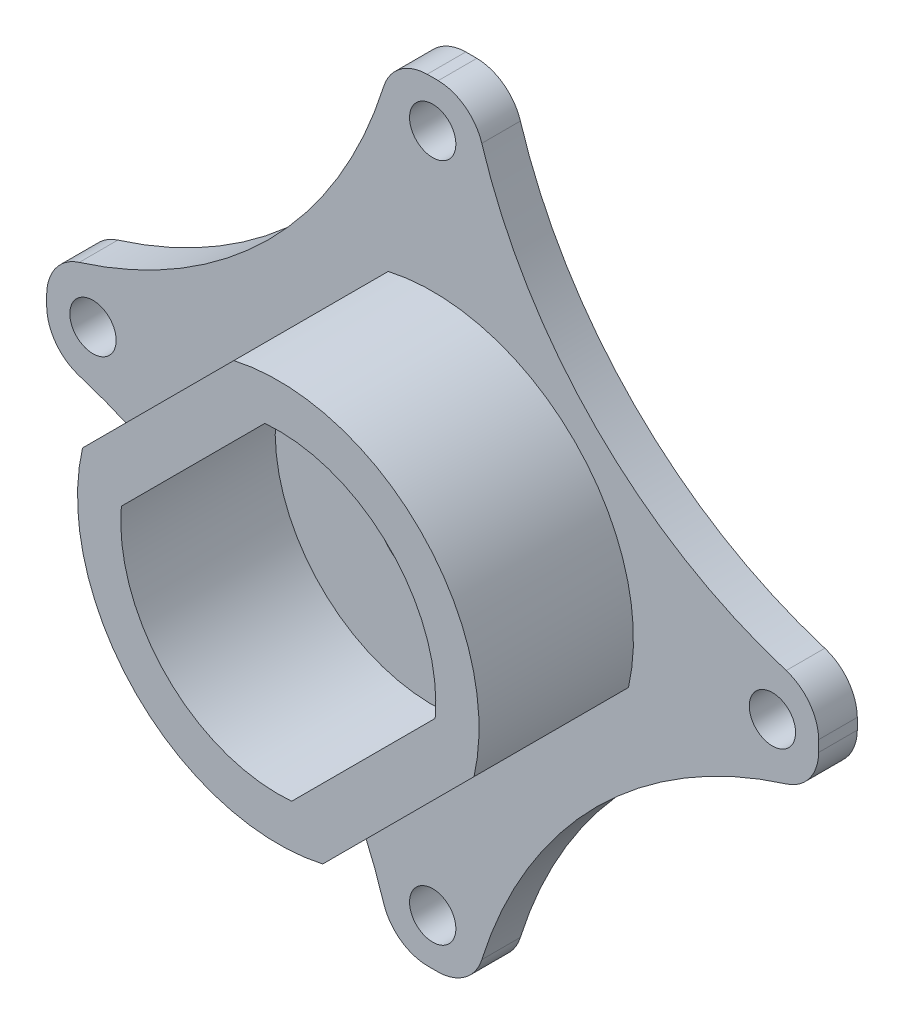
ISO-10303-21;
HEADER;
FILE_DESCRIPTION(('STEP AP214'),'2;1');
FILE_NAME('part.step','',(''),(''),'','','');
FILE_SCHEMA(('AUTOMOTIVE_DESIGN { 1 0 10303 214 1 1 1 1 }'));
ENDSEC;
DATA;
#1=APPLICATION_CONTEXT('core data for automotive mechanical design processes');
#2=APPLICATION_PROTOCOL_DEFINITION('international standard','automotive_design',2000,#1);
#3=PRODUCT_CONTEXT('',#1,'mechanical');
#4=PRODUCT('Part','Part','',(#3));
#5=PRODUCT_RELATED_PRODUCT_CATEGORY('part','',(#4));
#6=PRODUCT_DEFINITION_FORMATION('','',#4);
#7=PRODUCT_DEFINITION_CONTEXT('part definition',#1,'design');
#8=PRODUCT_DEFINITION('design','',#6,#7);
#9=PRODUCT_DEFINITION_SHAPE('','',#8);
#10=(LENGTH_UNIT() NAMED_UNIT(*) SI_UNIT(.MILLI.,.METRE.));
#11=(NAMED_UNIT(*) PLANE_ANGLE_UNIT() SI_UNIT($,.RADIAN.));
#12=(NAMED_UNIT(*) SI_UNIT($,.STERADIAN.) SOLID_ANGLE_UNIT());
#13=UNCERTAINTY_MEASURE_WITH_UNIT(LENGTH_MEASURE(1.E-05),#10,'distance_accuracy_value','');
#14=(GEOMETRIC_REPRESENTATION_CONTEXT(3) GLOBAL_UNCERTAINTY_ASSIGNED_CONTEXT((#13)) GLOBAL_UNIT_ASSIGNED_CONTEXT((#10,
#11,#12)) REPRESENTATION_CONTEXT('',''));
#15=CARTESIAN_POINT('',(0.,0.,0.));
#16=DIRECTION('',(0.,0.,1.));
#17=DIRECTION('',(1.,0.,0.));
#18=AXIS2_PLACEMENT_3D('',#15,#16,#17);
#19=CARTESIAN_POINT('',(0.,0.,2.5));
#20=DIRECTION('',(0.,0.,1.));
#21=DIRECTION('',(1.,0.,0.));
#22=AXIS2_PLACEMENT_3D('',#19,#20,#21);
#23=PLANE('',#22);
#24=CARTESIAN_POINT('',(31.8198051533946,31.8198051533947,2.5));
#25=DIRECTION('',(0.,0.,1.));
#26=DIRECTION('',(1.,0.,0.));
#27=AXIS2_PLACEMENT_3D('',#24,#25,#26);
#28=CIRCLE('',#27,30.);
#29=CARTESIAN_POINT('',(3.17944446720614,22.8906540310857,2.5));
#30=VERTEX_POINT('',#29);
#31=CARTESIAN_POINT('',(22.8906540310857,3.17944446720621,2.5));
#32=VERTEX_POINT('',#31);
#33=EDGE_CURVE('E316',#30,#32,#28,.T.);
#34=ORIENTED_EDGE('',*,*,#33,.F.);
#35=CARTESIAN_POINT('',(0.315408398587288,21.9977389188548,2.5));
#36=DIRECTION('',(0.,0.,1.));
#37=DIRECTION('',(1.,0.,0.));
#38=AXIS2_PLACEMENT_3D('',#35,#36,#37);
#39=CIRCLE('',#38,3.);
#40=CARTESIAN_POINT('',(0.358418634758282,24.9974305896078,2.5));
#41=VERTEX_POINT('',#40);
#42=EDGE_CURVE('E444',#30,#41,#39,.T.);
#43=ORIENTED_EDGE('',*,*,#42,.T.);
#44=CARTESIAN_POINT('',(0.,0.,2.5));
#45=DIRECTION('',(0.,0.,1.));
#46=DIRECTION('',(1.,0.,0.));
#47=AXIS2_PLACEMENT_3D('',#44,#45,#46);
#48=CIRCLE('',#47,25.);
#49=CARTESIAN_POINT('',(-0.358418634758457,24.9974305896078,2.5));
#50=VERTEX_POINT('',#49);
#51=EDGE_CURVE('E376',#41,#50,#48,.T.);
#52=ORIENTED_EDGE('',*,*,#51,.T.);
#53=CARTESIAN_POINT('',(-0.315408398587442,21.9977389188548,2.5));
#54=DIRECTION('',(0.,0.,1.));
#55=DIRECTION('',(1.,0.,0.));
#56=AXIS2_PLACEMENT_3D('',#53,#54,#55);
#57=CIRCLE('',#56,3.);
#58=CARTESIAN_POINT('',(-3.17944446720629,22.8906540310857,2.5));
#59=VERTEX_POINT('',#58);
#60=EDGE_CURVE('E441',#50,#59,#57,.T.);
#61=ORIENTED_EDGE('',*,*,#60,.T.);
#62=CARTESIAN_POINT('',(-31.8198051533948,31.8198051533945,2.5));
#63=DIRECTION('',(0.,0.,1.));
#64=DIRECTION('',(1.,0.,0.));
#65=AXIS2_PLACEMENT_3D('',#62,#63,#64);
#66=CIRCLE('',#65,30.);
#67=CARTESIAN_POINT('',(-22.8906540310857,3.17944446720605,2.5));
#68=VERTEX_POINT('',#67);
#69=EDGE_CURVE('E328',#68,#59,#66,.T.);
#70=ORIENTED_EDGE('',*,*,#69,.F.);
#71=CARTESIAN_POINT('',(-21.9977389188548,0.315408398587206,2.5));
#72=DIRECTION('',(0.,0.,1.));
#73=DIRECTION('',(1.,0.,0.));
#74=AXIS2_PLACEMENT_3D('',#71,#72,#73);
#75=CIRCLE('',#74,3.);
#76=CARTESIAN_POINT('',(-24.9974305896078,0.358418634758189,2.5));
#77=VERTEX_POINT('',#76);
#78=EDGE_CURVE('E438',#68,#77,#75,.T.);
#79=ORIENTED_EDGE('',*,*,#78,.T.);
#80=CARTESIAN_POINT('',(-24.9974305896078,-0.358418634758548,2.5));
#81=VERTEX_POINT('',#80);
#82=EDGE_CURVE('E534',#77,#81,#48,.T.);
#83=ORIENTED_EDGE('',*,*,#82,.T.);
#84=CARTESIAN_POINT('',(-21.9977389188548,-0.315408398587522,2.5));
#85=DIRECTION('',(0.,0.,1.));
#86=DIRECTION('',(1.,0.,0.));
#87=AXIS2_PLACEMENT_3D('',#84,#85,#86);
#88=CIRCLE('',#87,3.);
#89=CARTESIAN_POINT('',(-22.8906540310857,-3.17944446720637,2.5));
#90=VERTEX_POINT('',#89);
#91=EDGE_CURVE('E435',#81,#90,#88,.T.);
#92=ORIENTED_EDGE('',*,*,#91,.T.);
#93=CARTESIAN_POINT('',(-31.8198051533944,-31.8198051533949,2.5));
#94=DIRECTION('',(0.,0.,1.));
#95=DIRECTION('',(1.,0.,0.));
#96=AXIS2_PLACEMENT_3D('',#93,#94,#95);
#97=CIRCLE('',#96,30.);
#98=CARTESIAN_POINT('',(-3.17944446720598,-22.8906540310857,2.5));
#99=VERTEX_POINT('',#98);
#100=EDGE_CURVE('E324',#99,#90,#97,.T.);
#101=ORIENTED_EDGE('',*,*,#100,.F.);
#102=CARTESIAN_POINT('',(-0.315408398587139,-21.9977389188548,2.5));
#103=DIRECTION('',(0.,0.,1.));
#104=DIRECTION('',(1.,0.,0.));
#105=AXIS2_PLACEMENT_3D('',#102,#103,#104);
#106=CIRCLE('',#105,3.);
#107=CARTESIAN_POINT('',(-0.358418634758112,-24.9974305896078,2.5));
#108=VERTEX_POINT('',#107);
#109=EDGE_CURVE('E432',#99,#108,#106,.T.);
#110=ORIENTED_EDGE('',*,*,#109,.T.);
#111=CARTESIAN_POINT('',(0.358418634758633,-24.9974305896078,2.5));
#112=VERTEX_POINT('',#111);
#113=EDGE_CURVE('E374',#108,#112,#48,.T.);
#114=ORIENTED_EDGE('',*,*,#113,.T.);
#115=CARTESIAN_POINT('',(0.315408398587597,-21.9977389188548,2.5));
#116=DIRECTION('',(0.,0.,1.));
#117=DIRECTION('',(1.,0.,0.));
#118=AXIS2_PLACEMENT_3D('',#115,#116,#117);
#119=CIRCLE('',#118,3.);
#120=CARTESIAN_POINT('',(3.17944446720645,-22.8906540310857,2.5));
#121=VERTEX_POINT('',#120);
#122=EDGE_CURVE('E429',#112,#121,#119,.T.);
#123=ORIENTED_EDGE('',*,*,#122,.T.);
#124=CARTESIAN_POINT('',(31.819805153395,-31.8198051533942,2.5));
#125=DIRECTION('',(0.,0.,1.));
#126=DIRECTION('',(1.,0.,0.));
#127=AXIS2_PLACEMENT_3D('',#124,#125,#126);
#128=CIRCLE('',#127,30.);
#129=CARTESIAN_POINT('',(22.8906540310858,-3.17944446720589,2.5));
#130=VERTEX_POINT('',#129);
#131=EDGE_CURVE('E320',#130,#121,#128,.T.);
#132=ORIENTED_EDGE('',*,*,#131,.F.);
#133=CARTESIAN_POINT('',(21.9977389188548,-0.315408398587054,2.5));
#134=DIRECTION('',(0.,0.,1.));
#135=DIRECTION('',(1.,0.,0.));
#136=AXIS2_PLACEMENT_3D('',#133,#134,#135);
#137=CIRCLE('',#136,3.);
#138=CARTESIAN_POINT('',(24.9974305896078,-0.358418634758015,2.5));
#139=VERTEX_POINT('',#138);
#140=EDGE_CURVE('E426',#130,#139,#137,.T.);
#141=ORIENTED_EDGE('',*,*,#140,.T.);
#142=CARTESIAN_POINT('',(24.9974305896078,0.358418634758364,2.5));
#143=VERTEX_POINT('',#142);
#144=EDGE_CURVE('E370',#139,#143,#48,.T.);
#145=ORIENTED_EDGE('',*,*,#144,.T.);
#146=CARTESIAN_POINT('',(21.9977389188548,0.315408398587361,2.5));
#147=DIRECTION('',(0.,0.,1.));
#148=DIRECTION('',(1.,0.,0.));
#149=AXIS2_PLACEMENT_3D('',#146,#147,#148);
#150=CIRCLE('',#149,3.);
#151=EDGE_CURVE('E423',#143,#32,#150,.T.);
#152=ORIENTED_EDGE('',*,*,#151,.T.);
#153=EDGE_LOOP('',(#34,#43,#52,#61,#70,#79,#83,#92,#101,#110,#114,#123,#132,#141,#145,#152));
#154=FACE_BOUND('',#153,.T.);
#155=CARTESIAN_POINT('',(22.,-2.26077837006677E-12,2.5));
#156=DIRECTION('',(0.,0.,1.));
#157=DIRECTION('',(1.,0.,0.));
#158=AXIS2_PLACEMENT_3D('',#155,#156,#157);
#159=CIRCLE('',#158,1.5);
#160=CARTESIAN_POINT('',(23.5,-2.26077837006677E-12,2.5));
#161=VERTEX_POINT('',#160);
#162=EDGE_CURVE('E346',#161,#161,#159,.T.);
#163=ORIENTED_EDGE('',*,*,#162,.F.);
#164=EDGE_LOOP('',(#163));
#165=FACE_BOUND('',#164,.T.);
#166=CARTESIAN_POINT('',(0.,22.,2.5));
#167=DIRECTION('',(0.,0.,1.));
#168=DIRECTION('',(1.,0.,0.));
#169=AXIS2_PLACEMENT_3D('',#166,#167,#168);
#170=CIRCLE('',#169,1.5);
#171=CARTESIAN_POINT('',(1.5,22.,2.5));
#172=VERTEX_POINT('',#171);
#173=EDGE_CURVE('E362',#172,#172,#170,.T.);
#174=ORIENTED_EDGE('',*,*,#173,.F.);
#175=EDGE_LOOP('',(#174));
#176=FACE_BOUND('',#175,.T.);
#177=CARTESIAN_POINT('',(-22.,-2.25991100832879E-12,2.5));
#178=DIRECTION('',(0.,0.,1.));
#179=DIRECTION('',(-1.,0.,0.));
#180=AXIS2_PLACEMENT_3D('',#177,#178,#179);
#181=CIRCLE('',#180,1.5);
#182=CARTESIAN_POINT('',(-23.5,-2.25991100832879E-12,2.5));
#183=VERTEX_POINT('',#182);
#184=EDGE_CURVE('E354',#183,#183,#181,.T.);
#185=ORIENTED_EDGE('',*,*,#184,.F.);
#186=EDGE_LOOP('',(#185));
#187=FACE_BOUND('',#186,.T.);
#188=CARTESIAN_POINT('',(-4.52068937839556E-12,-22.,2.5));
#189=DIRECTION('',(0.,0.,1.));
#190=DIRECTION('',(1.,0.,0.));
#191=AXIS2_PLACEMENT_3D('',#188,#189,#190);
#192=CIRCLE('',#191,1.5);
#193=CARTESIAN_POINT('',(1.49999999999548,-22.,2.5));
#194=VERTEX_POINT('',#193);
#195=EDGE_CURVE('E337',#194,#194,#192,.T.);
#196=ORIENTED_EDGE('',*,*,#195,.F.);
#197=EDGE_LOOP('',(#196));
#198=FACE_BOUND('',#197,.T.);
#199=DIRECTION('',(0.707106781186543,0.707106781186552,0.));
#200=VECTOR('',#199,1.);
#201=CARTESIAN_POINT('',(2.87919510748573,-12.6771540786184,2.5));
#202=LINE('',#201,#200);
#203=CARTESIAN_POINT('',(2.87919510748573,-12.6771540786184,2.5));
#204=VERTEX_POINT('',#203);
#205=CARTESIAN_POINT('',(12.6771540786184,-2.87919510748559,2.5));
#206=VERTEX_POINT('',#205);
#207=EDGE_CURVE('E280',#204,#206,#202,.T.);
#208=ORIENTED_EDGE('',*,*,#207,.F.);
#209=CARTESIAN_POINT('',(0.,0.,2.5));
#210=DIRECTION('',(0.,0.,1.));
#211=DIRECTION('',(1.,0.,0.));
#212=AXIS2_PLACEMENT_3D('',#209,#210,#211);
#213=CIRCLE('',#212,13.);
#214=CARTESIAN_POINT('',(-12.6771540786184,2.87919510748559,2.5));
#215=VERTEX_POINT('',#214);
#216=EDGE_CURVE('E230',#215,#204,#213,.T.);
#217=ORIENTED_EDGE('',*,*,#216,.F.);
#218=DIRECTION('',(-0.707106781186543,-0.707106781186551,0.));
#219=VECTOR('',#218,1.);
#220=CARTESIAN_POINT('',(-12.6771540786184,2.87919510748559,2.5));
#221=LINE('',#220,#219);
#222=CARTESIAN_POINT('',(-2.87919510748573,12.6771540786184,2.5));
#223=VERTEX_POINT('',#222);
#224=EDGE_CURVE('E267',#223,#215,#221,.T.);
#225=ORIENTED_EDGE('',*,*,#224,.F.);
#226=CARTESIAN_POINT('',(0.,0.,2.5));
#227=DIRECTION('',(0.,0.,1.));
#228=DIRECTION('',(1.,0.,0.));
#229=AXIS2_PLACEMENT_3D('',#226,#227,#228);
#230=CIRCLE('',#229,13.);
#231=EDGE_CURVE('E283',#206,#223,#230,.T.);
#232=ORIENTED_EDGE('',*,*,#231,.F.);
#233=EDGE_LOOP('',(#208,#217,#225,#232));
#234=FACE_BOUND('',#233,.T.);
#235=ADVANCED_FACE('F47',(#154,#165,#176,#187,#198,#234),#23,.T.);
#236=CARTESIAN_POINT('',(0.,0.,2.5));
#237=DIRECTION('',(0.,0.,-1.));
#238=DIRECTION('',(-1.,0.,0.));
#239=AXIS2_PLACEMENT_3D('',#236,#237,#238);
#240=CYLINDRICAL_SURFACE('',#239,25.);
#241=ORIENTED_EDGE('',*,*,#51,.F.);
#242=DIRECTION('',(0.,0.,-1.));
#243=VECTOR('',#242,1.);
#244=CARTESIAN_POINT('',(0.358418634758282,24.9974305896078,2.5));
#245=LINE('',#244,#243);
#246=CARTESIAN_POINT('',(0.358418634758282,24.9974305896078,0.));
#247=VERTEX_POINT('',#246);
#248=EDGE_CURVE('E389',#41,#247,#245,.T.);
#249=ORIENTED_EDGE('',*,*,#248,.T.);
#250=CARTESIAN_POINT('',(0.,0.,0.));
#251=DIRECTION('',(0.,0.,1.));
#252=DIRECTION('',(1.,0.,0.));
#253=AXIS2_PLACEMENT_3D('',#250,#251,#252);
#254=CIRCLE('',#253,25.);
#255=CARTESIAN_POINT('',(-0.358418634758457,24.9974305896078,0.));
#256=VERTEX_POINT('',#255);
#257=EDGE_CURVE('E375',#247,#256,#254,.T.);
#258=ORIENTED_EDGE('',*,*,#257,.T.);
#259=DIRECTION('',(0.,0.,-1.));
#260=VECTOR('',#259,1.);
#261=CARTESIAN_POINT('',(-0.358418634758457,24.9974305896078,2.5));
#262=LINE('',#261,#260);
#263=EDGE_CURVE('E385',#256,#50,#262,.F.);
#264=ORIENTED_EDGE('',*,*,#263,.T.);
#265=EDGE_LOOP('',(#241,#249,#258,#264));
#266=FACE_BOUND('',#265,.T.);
#267=ADVANCED_FACE('F516',(#266),#240,.T.);
#268=ORIENTED_EDGE('',*,*,#82,.F.);
#269=DIRECTION('',(0.,0.,-1.));
#270=VECTOR('',#269,1.);
#271=CARTESIAN_POINT('',(-24.9974305896078,0.358418634758189,2.5));
#272=LINE('',#271,#270);
#273=CARTESIAN_POINT('',(-24.9974305896078,0.358418634758189,0.));
#274=VERTEX_POINT('',#273);
#275=EDGE_CURVE('E457',#77,#274,#272,.T.);
#276=ORIENTED_EDGE('',*,*,#275,.T.);
#277=CARTESIAN_POINT('',(-24.9974305896078,-0.358418634758548,0.));
#278=VERTEX_POINT('',#277);
#279=EDGE_CURVE('E381',#274,#278,#254,.T.);
#280=ORIENTED_EDGE('',*,*,#279,.T.);
#281=DIRECTION('',(0.,0.,-1.));
#282=VECTOR('',#281,1.);
#283=CARTESIAN_POINT('',(-24.9974305896078,-0.358418634758548,2.5));
#284=LINE('',#283,#282);
#285=EDGE_CURVE('E453',#278,#81,#284,.F.);
#286=ORIENTED_EDGE('',*,*,#285,.T.);
#287=EDGE_LOOP('',(#268,#276,#280,#286));
#288=FACE_BOUND('',#287,.T.);
#289=ADVANCED_FACE('F535',(#288),#240,.T.);
#290=ORIENTED_EDGE('',*,*,#113,.F.);
#291=DIRECTION('',(0.,0.,-1.));
#292=VECTOR('',#291,1.);
#293=CARTESIAN_POINT('',(-0.358418634758112,-24.9974305896078,2.5));
#294=LINE('',#293,#292);
#295=CARTESIAN_POINT('',(-0.358418634758112,-24.9974305896078,0.));
#296=VERTEX_POINT('',#295);
#297=EDGE_CURVE('E471',#108,#296,#294,.T.);
#298=ORIENTED_EDGE('',*,*,#297,.T.);
#299=CARTESIAN_POINT('',(0.358418634758633,-24.9974305896078,0.));
#300=VERTEX_POINT('',#299);
#301=EDGE_CURVE('E377',#296,#300,#254,.T.);
#302=ORIENTED_EDGE('',*,*,#301,.T.);
#303=DIRECTION('',(0.,0.,-1.));
#304=VECTOR('',#303,1.);
#305=CARTESIAN_POINT('',(0.358418634758633,-24.9974305896078,2.5));
#306=LINE('',#305,#304);
#307=EDGE_CURVE('E467',#300,#112,#306,.F.);
#308=ORIENTED_EDGE('',*,*,#307,.T.);
#309=EDGE_LOOP('',(#290,#298,#302,#308));
#310=FACE_BOUND('',#309,.T.);
#311=ADVANCED_FACE('F545',(#310),#240,.T.);
#312=CARTESIAN_POINT('',(0.,0.,2.5));
#313=DIRECTION('',(0.,0.,1.));
#314=DIRECTION('',(1.,0.,0.));
#315=AXIS2_PLACEMENT_3D('',#312,#313,#314);
#316=CIRCLE('',#315,10.2);
#317=CARTESIAN_POINT('',(-10.163012908704,0.867852877806112,2.5));
#318=VERTEX_POINT('',#317);
#319=CARTESIAN_POINT('',(0.867852877806223,-10.163012908704,2.5));
#320=VERTEX_POINT('',#319);
#321=EDGE_CURVE('E71',#318,#320,#316,.T.);
#322=ORIENTED_EDGE('',*,*,#321,.T.);
#323=DIRECTION('',(0.707106781186544,0.707106781186551,0.));
#324=VECTOR('',#323,1.);
#325=CARTESIAN_POINT('',(0.867852877806221,-10.163012908704,2.5));
#326=LINE('',#325,#324);
#327=CARTESIAN_POINT('',(10.163012908704,-0.867852877806111,2.5));
#328=VERTEX_POINT('',#327);
#329=EDGE_CURVE('E228',#320,#328,#326,.T.);
#330=ORIENTED_EDGE('',*,*,#329,.T.);
#331=CARTESIAN_POINT('',(0.,0.,2.5));
#332=DIRECTION('',(0.,0.,1.));
#333=DIRECTION('',(1.,0.,0.));
#334=AXIS2_PLACEMENT_3D('',#331,#332,#333);
#335=CIRCLE('',#334,10.2);
#336=CARTESIAN_POINT('',(-0.867852877806226,10.163012908704,2.5));
#337=VERTEX_POINT('',#336);
#338=EDGE_CURVE('E249',#328,#337,#335,.T.);
#339=ORIENTED_EDGE('',*,*,#338,.T.);
#340=DIRECTION('',(-0.707106781186544,-0.707106781186551,0.));
#341=VECTOR('',#340,1.);
#342=CARTESIAN_POINT('',(-10.163012908704,0.867852877806111,2.5));
#343=LINE('',#342,#341);
#344=EDGE_CURVE('E222',#337,#318,#343,.T.);
#345=ORIENTED_EDGE('',*,*,#344,.T.);
#346=EDGE_LOOP('',(#322,#330,#339,#345));
#347=FACE_BOUND('',#346,.T.);
#348=CARTESIAN_POINT('',(0.,0.,2.5));
#349=DIRECTION('',(0.,0.,-1.));
#350=DIRECTION('',(-1.,0.,0.));
#351=AXIS2_PLACEMENT_3D('',#348,#349,#350);
#352=CIRCLE('',#351,4.);
#353=CARTESIAN_POINT('',(-4.,0.,2.5));
#354=VERTEX_POINT('',#353);
#355=EDGE_CURVE('E332',#354,#354,#352,.T.);
#356=ORIENTED_EDGE('',*,*,#355,.T.);
#357=EDGE_LOOP('',(#356));
#358=FACE_BOUND('',#357,.T.);
#359=ADVANCED_FACE('F569',(#347,#358),#23,.T.);
#360=CARTESIAN_POINT('',(0.,0.,0.));
#361=DIRECTION('',(0.,0.,1.));
#362=DIRECTION('',(1.,0.,0.));
#363=AXIS2_PLACEMENT_3D('',#360,#361,#362);
#364=PLANE('',#363);
#365=CARTESIAN_POINT('',(0.,0.,0.));
#366=DIRECTION('',(0.,0.,1.));
#367=DIRECTION('',(1.,0.,0.));
#368=AXIS2_PLACEMENT_3D('',#365,#366,#367);
#369=CIRCLE('',#368,4.);
#370=CARTESIAN_POINT('',(4.,0.,0.));
#371=VERTEX_POINT('',#370);
#372=EDGE_CURVE('E336',#371,#371,#369,.T.);
#373=ORIENTED_EDGE('',*,*,#372,.T.);
#374=EDGE_LOOP('',(#373));
#375=FACE_BOUND('',#374,.T.);
#376=ORIENTED_EDGE('',*,*,#257,.F.);
#377=CARTESIAN_POINT('',(0.315408398587288,21.9977389188548,0.));
#378=DIRECTION('',(0.,0.,1.));
#379=DIRECTION('',(1.,0.,0.));
#380=AXIS2_PLACEMENT_3D('',#377,#378,#379);
#381=CIRCLE('',#380,3.);
#382=CARTESIAN_POINT('',(3.17944446720614,22.8906540310857,0.));
#383=VERTEX_POINT('',#382);
#384=EDGE_CURVE('E414',#247,#383,#381,.F.);
#385=ORIENTED_EDGE('',*,*,#384,.T.);
#386=CARTESIAN_POINT('',(31.8198051533946,31.8198051533947,0.));
#387=DIRECTION('',(0.,0.,-1.));
#388=DIRECTION('',(-1.,0.,0.));
#389=AXIS2_PLACEMENT_3D('',#386,#387,#388);
#390=CIRCLE('',#389,30.);
#391=CARTESIAN_POINT('',(22.8906540310857,3.17944446720621,0.));
#392=VERTEX_POINT('',#391);
#393=EDGE_CURVE('E305',#392,#383,#390,.T.);
#394=ORIENTED_EDGE('',*,*,#393,.F.);
#395=CARTESIAN_POINT('',(21.9977389188548,0.315408398587361,0.));
#396=DIRECTION('',(0.,0.,1.));
#397=DIRECTION('',(1.,0.,0.));
#398=AXIS2_PLACEMENT_3D('',#395,#396,#397);
#399=CIRCLE('',#398,3.);
#400=CARTESIAN_POINT('',(24.9974305896078,0.358418634758364,0.));
#401=VERTEX_POINT('',#400);
#402=EDGE_CURVE('E393',#392,#401,#399,.F.);
#403=ORIENTED_EDGE('',*,*,#402,.T.);
#404=CARTESIAN_POINT('',(24.9974305896078,-0.358418634758015,0.));
#405=VERTEX_POINT('',#404);
#406=EDGE_CURVE('E366',#405,#401,#254,.T.);
#407=ORIENTED_EDGE('',*,*,#406,.F.);
#408=CARTESIAN_POINT('',(21.9977389188548,-0.315408398587054,0.));
#409=DIRECTION('',(0.,0.,1.));
#410=DIRECTION('',(1.,0.,0.));
#411=AXIS2_PLACEMENT_3D('',#408,#409,#410);
#412=CIRCLE('',#411,3.);
#413=CARTESIAN_POINT('',(22.8906540310858,-3.17944446720589,0.));
#414=VERTEX_POINT('',#413);
#415=EDGE_CURVE('E396',#405,#414,#412,.F.);
#416=ORIENTED_EDGE('',*,*,#415,.T.);
#417=CARTESIAN_POINT('',(31.819805153395,-31.8198051533942,0.));
#418=DIRECTION('',(0.,0.,-1.));
#419=DIRECTION('',(-1.,0.,0.));
#420=AXIS2_PLACEMENT_3D('',#417,#418,#419);
#421=CIRCLE('',#420,30.);
#422=CARTESIAN_POINT('',(3.17944446720645,-22.8906540310857,0.));
#423=VERTEX_POINT('',#422);
#424=EDGE_CURVE('E301',#423,#414,#421,.T.);
#425=ORIENTED_EDGE('',*,*,#424,.F.);
#426=CARTESIAN_POINT('',(0.315408398587597,-21.9977389188548,0.));
#427=DIRECTION('',(0.,0.,1.));
#428=DIRECTION('',(1.,0.,0.));
#429=AXIS2_PLACEMENT_3D('',#426,#427,#428);
#430=CIRCLE('',#429,3.);
#431=EDGE_CURVE('E399',#423,#300,#430,.F.);
#432=ORIENTED_EDGE('',*,*,#431,.T.);
#433=ORIENTED_EDGE('',*,*,#301,.F.);
#434=CARTESIAN_POINT('',(-0.315408398587139,-21.9977389188548,0.));
#435=DIRECTION('',(0.,0.,1.));
#436=DIRECTION('',(1.,0.,0.));
#437=AXIS2_PLACEMENT_3D('',#434,#435,#436);
#438=CIRCLE('',#437,3.);
#439=CARTESIAN_POINT('',(-3.17944446720598,-22.8906540310857,0.));
#440=VERTEX_POINT('',#439);
#441=EDGE_CURVE('E402',#296,#440,#438,.F.);
#442=ORIENTED_EDGE('',*,*,#441,.T.);
#443=CARTESIAN_POINT('',(-31.8198051533944,-31.8198051533949,0.));
#444=DIRECTION('',(0.,0.,-1.));
#445=DIRECTION('',(-1.,0.,0.));
#446=AXIS2_PLACEMENT_3D('',#443,#444,#445);
#447=CIRCLE('',#446,30.);
#448=CARTESIAN_POINT('',(-22.8906540310857,-3.17944446720637,0.));
#449=VERTEX_POINT('',#448);
#450=EDGE_CURVE('E306',#449,#440,#447,.T.);
#451=ORIENTED_EDGE('',*,*,#450,.F.);
#452=CARTESIAN_POINT('',(-21.9977389188548,-0.315408398587522,0.));
#453=DIRECTION('',(0.,0.,1.));
#454=DIRECTION('',(1.,0.,0.));
#455=AXIS2_PLACEMENT_3D('',#452,#453,#454);
#456=CIRCLE('',#455,3.);
#457=EDGE_CURVE('E405',#449,#278,#456,.F.);
#458=ORIENTED_EDGE('',*,*,#457,.T.);
#459=ORIENTED_EDGE('',*,*,#279,.F.);
#460=CARTESIAN_POINT('',(-21.9977389188548,0.315408398587206,0.));
#461=DIRECTION('',(0.,0.,1.));
#462=DIRECTION('',(1.,0.,0.));
#463=AXIS2_PLACEMENT_3D('',#460,#461,#462);
#464=CIRCLE('',#463,3.);
#465=CARTESIAN_POINT('',(-22.8906540310857,3.17944446720605,0.));
#466=VERTEX_POINT('',#465);
#467=EDGE_CURVE('E408',#274,#466,#464,.F.);
#468=ORIENTED_EDGE('',*,*,#467,.T.);
#469=CARTESIAN_POINT('',(-31.8198051533948,31.8198051533945,0.));
#470=DIRECTION('',(0.,0.,-1.));
#471=DIRECTION('',(-1.,0.,0.));
#472=AXIS2_PLACEMENT_3D('',#469,#470,#471);
#473=CIRCLE('',#472,30.);
#474=CARTESIAN_POINT('',(-3.17944446720629,22.8906540310857,0.));
#475=VERTEX_POINT('',#474);
#476=EDGE_CURVE('E300',#475,#466,#473,.T.);
#477=ORIENTED_EDGE('',*,*,#476,.F.);
#478=CARTESIAN_POINT('',(-0.315408398587442,21.9977389188548,0.));
#479=DIRECTION('',(0.,0.,1.));
#480=DIRECTION('',(1.,0.,0.));
#481=AXIS2_PLACEMENT_3D('',#478,#479,#480);
#482=CIRCLE('',#481,3.);
#483=EDGE_CURVE('E411',#475,#256,#482,.F.);
#484=ORIENTED_EDGE('',*,*,#483,.T.);
#485=EDGE_LOOP('',(#376,#385,#394,#403,#407,#416,#425,#432,#433,#442,#451,#458,#459,#468,#477,#484));
#486=FACE_BOUND('',#485,.T.);
#487=CARTESIAN_POINT('',(0.,22.,0.));
#488=DIRECTION('',(0.,0.,1.));
#489=DIRECTION('',(1.,0.,0.));
#490=AXIS2_PLACEMENT_3D('',#487,#488,#489);
#491=CIRCLE('',#490,1.5);
#492=CARTESIAN_POINT('',(1.5,22.,0.));
#493=VERTEX_POINT('',#492);
#494=EDGE_CURVE('E358',#493,#493,#491,.T.);
#495=ORIENTED_EDGE('',*,*,#494,.T.);
#496=EDGE_LOOP('',(#495));
#497=FACE_BOUND('',#496,.T.);
#498=CARTESIAN_POINT('',(-22.,-2.25991100832879E-12,0.));
#499=DIRECTION('',(0.,0.,1.));
#500=DIRECTION('',(-1.,0.,0.));
#501=AXIS2_PLACEMENT_3D('',#498,#499,#500);
#502=CIRCLE('',#501,1.5);
#503=CARTESIAN_POINT('',(-23.5,-2.25991100832879E-12,0.));
#504=VERTEX_POINT('',#503);
#505=EDGE_CURVE('E350',#504,#504,#502,.T.);
#506=ORIENTED_EDGE('',*,*,#505,.T.);
#507=EDGE_LOOP('',(#506));
#508=FACE_BOUND('',#507,.T.);
#509=CARTESIAN_POINT('',(22.,-2.26077837006677E-12,0.));
#510=DIRECTION('',(0.,0.,1.));
#511=DIRECTION('',(1.,0.,0.));
#512=AXIS2_PLACEMENT_3D('',#509,#510,#511);
#513=CIRCLE('',#512,1.5);
#514=CARTESIAN_POINT('',(23.5,-2.26077837006677E-12,0.));
#515=VERTEX_POINT('',#514);
#516=EDGE_CURVE('E341',#515,#515,#513,.T.);
#517=ORIENTED_EDGE('',*,*,#516,.T.);
#518=EDGE_LOOP('',(#517));
#519=FACE_BOUND('',#518,.T.);
#520=CARTESIAN_POINT('',(-4.52068937839556E-12,-22.,0.));
#521=DIRECTION('',(0.,0.,1.));
#522=DIRECTION('',(1.,0.,0.));
#523=AXIS2_PLACEMENT_3D('',#520,#521,#522);
#524=CIRCLE('',#523,1.5);
#525=CARTESIAN_POINT('',(1.49999999999548,-22.,0.));
#526=VERTEX_POINT('',#525);
#527=EDGE_CURVE('E342',#526,#526,#524,.T.);
#528=ORIENTED_EDGE('',*,*,#527,.T.);
#529=EDGE_LOOP('',(#528));
#530=FACE_BOUND('',#529,.T.);
#531=ADVANCED_FACE('F501',(#375,#486,#497,#508,#519,#530),#364,.F.);
#532=ORIENTED_EDGE('',*,*,#144,.F.);
#533=DIRECTION('',(0.,0.,-1.));
#534=VECTOR('',#533,1.);
#535=CARTESIAN_POINT('',(24.9974305896078,-0.358418634758015,2.5));
#536=LINE('',#535,#534);
#537=EDGE_CURVE('E11',#139,#405,#536,.T.);
#538=ORIENTED_EDGE('',*,*,#537,.T.);
#539=ORIENTED_EDGE('',*,*,#406,.T.);
#540=DIRECTION('',(0.,0.,-1.));
#541=VECTOR('',#540,1.);
#542=CARTESIAN_POINT('',(24.9974305896078,0.358418634758364,2.5));
#543=LINE('',#542,#541);
#544=EDGE_CURVE('E56',#401,#143,#543,.F.);
#545=ORIENTED_EDGE('',*,*,#544,.T.);
#546=EDGE_LOOP('',(#532,#538,#539,#545));
#547=FACE_BOUND('',#546,.T.);
#548=ADVANCED_FACE('F486',(#547),#240,.T.);
#549=CARTESIAN_POINT('',(0.,22.,2.5));
#550=DIRECTION('',(0.,0.,-1.));
#551=DIRECTION('',(-1.,0.,0.));
#552=AXIS2_PLACEMENT_3D('',#549,#550,#551);
#553=CYLINDRICAL_SURFACE('',#552,1.5);
#554=ORIENTED_EDGE('',*,*,#173,.T.);
#555=EDGE_LOOP('',(#554));
#556=FACE_BOUND('',#555,.T.);
#557=ORIENTED_EDGE('',*,*,#494,.F.);
#558=EDGE_LOOP('',(#557));
#559=FACE_BOUND('',#558,.T.);
#560=ADVANCED_FACE('F611',(#556,#559),#553,.F.);
#561=CARTESIAN_POINT('',(-22.,-2.25991100832879E-12,2.5));
#562=DIRECTION('',(0.,0.,-1.));
#563=DIRECTION('',(-1.,0.,0.));
#564=AXIS2_PLACEMENT_3D('',#561,#562,#563);
#565=CYLINDRICAL_SURFACE('',#564,1.5);
#566=ORIENTED_EDGE('',*,*,#184,.T.);
#567=EDGE_LOOP('',(#566));
#568=FACE_BOUND('',#567,.T.);
#569=ORIENTED_EDGE('',*,*,#505,.F.);
#570=EDGE_LOOP('',(#569));
#571=FACE_BOUND('',#570,.T.);
#572=ADVANCED_FACE('F608',(#568,#571),#565,.F.);
#573=CARTESIAN_POINT('',(22.,-2.26077837006677E-12,2.5));
#574=DIRECTION('',(0.,0.,-1.));
#575=DIRECTION('',(-1.,0.,0.));
#576=AXIS2_PLACEMENT_3D('',#573,#574,#575);
#577=CYLINDRICAL_SURFACE('',#576,1.5);
#578=ORIENTED_EDGE('',*,*,#162,.T.);
#579=EDGE_LOOP('',(#578));
#580=FACE_BOUND('',#579,.T.);
#581=ORIENTED_EDGE('',*,*,#516,.F.);
#582=EDGE_LOOP('',(#581));
#583=FACE_BOUND('',#582,.T.);
#584=ADVANCED_FACE('F601',(#580,#583),#577,.F.);
#585=CARTESIAN_POINT('',(-4.52068937839556E-12,-22.,2.5));
#586=DIRECTION('',(0.,0.,-1.));
#587=DIRECTION('',(-1.,0.,0.));
#588=AXIS2_PLACEMENT_3D('',#585,#586,#587);
#589=CYLINDRICAL_SURFACE('',#588,1.5);
#590=ORIENTED_EDGE('',*,*,#195,.T.);
#591=EDGE_LOOP('',(#590));
#592=FACE_BOUND('',#591,.T.);
#593=ORIENTED_EDGE('',*,*,#527,.F.);
#594=EDGE_LOOP('',(#593));
#595=FACE_BOUND('',#594,.T.);
#596=ADVANCED_FACE('F591',(#592,#595),#589,.F.);
#597=CARTESIAN_POINT('',(0.,0.,2.5));
#598=DIRECTION('',(0.,0.,-1.));
#599=DIRECTION('',(-1.,0.,0.));
#600=AXIS2_PLACEMENT_3D('',#597,#598,#599);
#601=CYLINDRICAL_SURFACE('',#600,4.);
#602=ORIENTED_EDGE('',*,*,#355,.F.);
#603=EDGE_LOOP('',(#602));
#604=FACE_BOUND('',#603,.T.);
#605=ORIENTED_EDGE('',*,*,#372,.F.);
#606=EDGE_LOOP('',(#605));
#607=FACE_BOUND('',#606,.T.);
#608=ADVANCED_FACE('F587',(#604,#607),#601,.F.);
#609=CARTESIAN_POINT('',(31.8198051533946,31.8198051533947,10.));
#610=DIRECTION('',(0.,0.,-1.));
#611=DIRECTION('',(-1.,0.,0.));
#612=AXIS2_PLACEMENT_3D('',#609,#610,#611);
#613=CYLINDRICAL_SURFACE('',#612,30.);
#614=ORIENTED_EDGE('',*,*,#393,.T.);
#615=DIRECTION('',(0.,0.,-1.));
#616=VECTOR('',#615,1.);
#617=CARTESIAN_POINT('',(3.17944446720613,22.8906540310857,10.));
#618=LINE('',#617,#616);
#619=EDGE_CURVE('E420',#383,#30,#618,.F.);
#620=ORIENTED_EDGE('',*,*,#619,.T.);
#621=ORIENTED_EDGE('',*,*,#33,.T.);
#622=DIRECTION('',(0.,0.,-1.));
#623=VECTOR('',#622,1.);
#624=CARTESIAN_POINT('',(22.8906540310857,3.17944446720621,10.));
#625=LINE('',#624,#623);
#626=EDGE_CURVE('E417',#32,#392,#625,.T.);
#627=ORIENTED_EDGE('',*,*,#626,.T.);
#628=EDGE_LOOP('',(#614,#620,#621,#627));
#629=FACE_BOUND('',#628,.T.);
#630=ADVANCED_FACE('F590',(#629),#613,.F.);
#631=CARTESIAN_POINT('',(31.819805153395,-31.8198051533942,10.));
#632=DIRECTION('',(0.,0.,-1.));
#633=DIRECTION('',(-1.,0.,0.));
#634=AXIS2_PLACEMENT_3D('',#631,#632,#633);
#635=CYLINDRICAL_SURFACE('',#634,30.);
#636=ORIENTED_EDGE('',*,*,#131,.T.);
#637=DIRECTION('',(0.,0.,-1.));
#638=VECTOR('',#637,1.);
#639=CARTESIAN_POINT('',(3.17944446720645,-22.8906540310857,10.));
#640=LINE('',#639,#638);
#641=EDGE_CURVE('E478',#121,#423,#640,.T.);
#642=ORIENTED_EDGE('',*,*,#641,.T.);
#643=ORIENTED_EDGE('',*,*,#424,.T.);
#644=DIRECTION('',(0.,0.,-1.));
#645=VECTOR('',#644,1.);
#646=CARTESIAN_POINT('',(22.8906540310858,-3.17944446720589,10.));
#647=LINE('',#646,#645);
#648=EDGE_CURVE('E475',#414,#130,#647,.F.);
#649=ORIENTED_EDGE('',*,*,#648,.T.);
#650=EDGE_LOOP('',(#636,#642,#643,#649));
#651=FACE_BOUND('',#650,.T.);
#652=ADVANCED_FACE('F598',(#651),#635,.F.);
#653=CARTESIAN_POINT('',(-31.8198051533944,-31.8198051533949,10.));
#654=DIRECTION('',(0.,0.,-1.));
#655=DIRECTION('',(-1.,0.,0.));
#656=AXIS2_PLACEMENT_3D('',#653,#654,#655);
#657=CYLINDRICAL_SURFACE('',#656,30.);
#658=ORIENTED_EDGE('',*,*,#100,.T.);
#659=DIRECTION('',(0.,0.,-1.));
#660=VECTOR('',#659,1.);
#661=CARTESIAN_POINT('',(-22.8906540310857,-3.17944446720637,10.));
#662=LINE('',#661,#660);
#663=EDGE_CURVE('E464',#90,#449,#662,.T.);
#664=ORIENTED_EDGE('',*,*,#663,.T.);
#665=ORIENTED_EDGE('',*,*,#450,.T.);
#666=DIRECTION('',(0.,0.,-1.));
#667=VECTOR('',#666,1.);
#668=CARTESIAN_POINT('',(-3.17944446720597,-22.8906540310857,10.));
#669=LINE('',#668,#667);
#670=EDGE_CURVE('E461',#440,#99,#669,.F.);
#671=ORIENTED_EDGE('',*,*,#670,.T.);
#672=EDGE_LOOP('',(#658,#664,#665,#671));
#673=FACE_BOUND('',#672,.T.);
#674=ADVANCED_FACE('F554',(#673),#657,.F.);
#675=CARTESIAN_POINT('',(-31.8198051533948,31.8198051533945,10.));
#676=DIRECTION('',(0.,0.,-1.));
#677=DIRECTION('',(-1.,0.,0.));
#678=AXIS2_PLACEMENT_3D('',#675,#676,#677);
#679=CYLINDRICAL_SURFACE('',#678,30.);
#680=ORIENTED_EDGE('',*,*,#69,.T.);
#681=DIRECTION('',(0.,0.,-1.));
#682=VECTOR('',#681,1.);
#683=CARTESIAN_POINT('',(-3.17944446720629,22.8906540310857,10.));
#684=LINE('',#683,#682);
#685=EDGE_CURVE('E450',#59,#475,#684,.T.);
#686=ORIENTED_EDGE('',*,*,#685,.T.);
#687=ORIENTED_EDGE('',*,*,#476,.T.);
#688=DIRECTION('',(0.,0.,-1.));
#689=VECTOR('',#688,1.);
#690=CARTESIAN_POINT('',(-22.8906540310857,3.17944446720605,10.));
#691=LINE('',#690,#689);
#692=EDGE_CURVE('E447',#466,#68,#691,.F.);
#693=ORIENTED_EDGE('',*,*,#692,.T.);
#694=EDGE_LOOP('',(#680,#686,#687,#693));
#695=FACE_BOUND('',#694,.T.);
#696=ADVANCED_FACE('F526',(#695),#679,.F.);
#697=CARTESIAN_POINT('',(0.315408398587288,21.9977389188548,10.));
#698=DIRECTION('',(0.,0.,1.));
#699=DIRECTION('',(1.,0.,0.));
#700=AXIS2_PLACEMENT_3D('',#697,#698,#699);
#701=CYLINDRICAL_SURFACE('',#700,3.);
#702=ORIENTED_EDGE('',*,*,#42,.F.);
#703=ORIENTED_EDGE('',*,*,#619,.F.);
#704=ORIENTED_EDGE('',*,*,#384,.F.);
#705=ORIENTED_EDGE('',*,*,#248,.F.);
#706=EDGE_LOOP('',(#702,#703,#704,#705));
#707=FACE_BOUND('',#706,.T.);
#708=ADVANCED_FACE('F672',(#707),#701,.T.);
#709=CARTESIAN_POINT('',(-0.315408398587442,21.9977389188548,10.));
#710=DIRECTION('',(0.,0.,-1.));
#711=DIRECTION('',(-1.,0.,0.));
#712=AXIS2_PLACEMENT_3D('',#709,#710,#711);
#713=CYLINDRICAL_SURFACE('',#712,3.);
#714=ORIENTED_EDGE('',*,*,#483,.F.);
#715=ORIENTED_EDGE('',*,*,#685,.F.);
#716=ORIENTED_EDGE('',*,*,#60,.F.);
#717=ORIENTED_EDGE('',*,*,#263,.F.);
#718=EDGE_LOOP('',(#714,#715,#716,#717));
#719=FACE_BOUND('',#718,.T.);
#720=ADVANCED_FACE('F521',(#719),#713,.T.);
#721=CARTESIAN_POINT('',(-21.9977389188548,0.315408398587206,10.));
#722=DIRECTION('',(0.,0.,1.));
#723=DIRECTION('',(1.,0.,0.));
#724=AXIS2_PLACEMENT_3D('',#721,#722,#723);
#725=CYLINDRICAL_SURFACE('',#724,3.);
#726=ORIENTED_EDGE('',*,*,#78,.F.);
#727=ORIENTED_EDGE('',*,*,#692,.F.);
#728=ORIENTED_EDGE('',*,*,#467,.F.);
#729=ORIENTED_EDGE('',*,*,#275,.F.);
#730=EDGE_LOOP('',(#726,#727,#728,#729));
#731=FACE_BOUND('',#730,.T.);
#732=ADVANCED_FACE('F530',(#731),#725,.T.);
#733=CARTESIAN_POINT('',(-21.9977389188548,-0.315408398587522,10.));
#734=DIRECTION('',(0.,0.,-1.));
#735=DIRECTION('',(-1.,0.,0.));
#736=AXIS2_PLACEMENT_3D('',#733,#734,#735);
#737=CYLINDRICAL_SURFACE('',#736,3.);
#738=ORIENTED_EDGE('',*,*,#457,.F.);
#739=ORIENTED_EDGE('',*,*,#663,.F.);
#740=ORIENTED_EDGE('',*,*,#91,.F.);
#741=ORIENTED_EDGE('',*,*,#285,.F.);
#742=EDGE_LOOP('',(#738,#739,#740,#741));
#743=FACE_BOUND('',#742,.T.);
#744=ADVANCED_FACE('F557',(#743),#737,.T.);
#745=CARTESIAN_POINT('',(-0.315408398587139,-21.9977389188548,10.));
#746=DIRECTION('',(0.,0.,1.));
#747=DIRECTION('',(1.,0.,0.));
#748=AXIS2_PLACEMENT_3D('',#745,#746,#747);
#749=CYLINDRICAL_SURFACE('',#748,3.);
#750=ORIENTED_EDGE('',*,*,#109,.F.);
#751=ORIENTED_EDGE('',*,*,#670,.F.);
#752=ORIENTED_EDGE('',*,*,#441,.F.);
#753=ORIENTED_EDGE('',*,*,#297,.F.);
#754=EDGE_LOOP('',(#750,#751,#752,#753));
#755=FACE_BOUND('',#754,.T.);
#756=ADVANCED_FACE('F549',(#755),#749,.T.);
#757=CARTESIAN_POINT('',(0.315408398587597,-21.9977389188548,10.));
#758=DIRECTION('',(0.,0.,-1.));
#759=DIRECTION('',(-1.,0.,0.));
#760=AXIS2_PLACEMENT_3D('',#757,#758,#759);
#761=CYLINDRICAL_SURFACE('',#760,3.);
#762=ORIENTED_EDGE('',*,*,#431,.F.);
#763=ORIENTED_EDGE('',*,*,#641,.F.);
#764=ORIENTED_EDGE('',*,*,#122,.F.);
#765=ORIENTED_EDGE('',*,*,#307,.F.);
#766=EDGE_LOOP('',(#762,#763,#764,#765));
#767=FACE_BOUND('',#766,.T.);
#768=ADVANCED_FACE('F564',(#767),#761,.T.);
#769=CARTESIAN_POINT('',(21.9977389188548,-0.315408398587054,10.));
#770=DIRECTION('',(0.,0.,1.));
#771=DIRECTION('',(1.,0.,0.));
#772=AXIS2_PLACEMENT_3D('',#769,#770,#771);
#773=CYLINDRICAL_SURFACE('',#772,3.);
#774=ORIENTED_EDGE('',*,*,#140,.F.);
#775=ORIENTED_EDGE('',*,*,#648,.F.);
#776=ORIENTED_EDGE('',*,*,#415,.F.);
#777=ORIENTED_EDGE('',*,*,#537,.F.);
#778=EDGE_LOOP('',(#774,#775,#776,#777));
#779=FACE_BOUND('',#778,.T.);
#780=ADVANCED_FACE('F498',(#779),#773,.T.);
#781=CARTESIAN_POINT('',(21.9977389188548,0.315408398587361,10.));
#782=DIRECTION('',(0.,0.,-1.));
#783=DIRECTION('',(-1.,0.,0.));
#784=AXIS2_PLACEMENT_3D('',#781,#782,#783);
#785=CYLINDRICAL_SURFACE('',#784,3.);
#786=ORIENTED_EDGE('',*,*,#402,.F.);
#787=ORIENTED_EDGE('',*,*,#626,.F.);
#788=ORIENTED_EDGE('',*,*,#151,.F.);
#789=ORIENTED_EDGE('',*,*,#544,.F.);
#790=EDGE_LOOP('',(#786,#787,#788,#789));
#791=FACE_BOUND('',#790,.T.);
#792=ADVANCED_FACE('F49',(#791),#785,.T.);
#793=CARTESIAN_POINT('',(0.,0.,12.5));
#794=DIRECTION('',(0.,0.,1.));
#795=DIRECTION('',(1.,0.,0.));
#796=AXIS2_PLACEMENT_3D('',#793,#794,#795);
#797=PLANE('',#796);
#798=CARTESIAN_POINT('',(0.,0.,12.5));
#799=DIRECTION('',(0.,0.,1.));
#800=DIRECTION('',(1.,0.,0.));
#801=AXIS2_PLACEMENT_3D('',#798,#799,#800);
#802=CIRCLE('',#801,13.);
#803=CARTESIAN_POINT('',(-12.6771540786184,2.87919510748559,12.5));
#804=VERTEX_POINT('',#803);
#805=CARTESIAN_POINT('',(2.87919510748573,-12.6771540786184,12.5));
#806=VERTEX_POINT('',#805);
#807=EDGE_CURVE('E262',#804,#806,#802,.T.);
#808=ORIENTED_EDGE('',*,*,#807,.T.);
#809=DIRECTION('',(0.707106781186543,0.707106781186552,0.));
#810=VECTOR('',#809,1.);
#811=CARTESIAN_POINT('',(2.87919510748573,-12.6771540786184,12.5));
#812=LINE('',#811,#810);
#813=CARTESIAN_POINT('',(12.6771540786184,-2.87919510748559,12.5));
#814=VERTEX_POINT('',#813);
#815=EDGE_CURVE('E266',#806,#814,#812,.T.);
#816=ORIENTED_EDGE('',*,*,#815,.T.);
#817=CARTESIAN_POINT('',(0.,0.,12.5));
#818=DIRECTION('',(0.,0.,1.));
#819=DIRECTION('',(1.,0.,0.));
#820=AXIS2_PLACEMENT_3D('',#817,#818,#819);
#821=CIRCLE('',#820,13.);
#822=CARTESIAN_POINT('',(-2.87919510748573,12.6771540786184,12.5));
#823=VERTEX_POINT('',#822);
#824=EDGE_CURVE('E270',#814,#823,#821,.T.);
#825=ORIENTED_EDGE('',*,*,#824,.T.);
#826=DIRECTION('',(-0.707106781186543,-0.707106781186551,0.));
#827=VECTOR('',#826,1.);
#828=CARTESIAN_POINT('',(-12.6771540786184,2.87919510748559,12.5));
#829=LINE('',#828,#827);
#830=EDGE_CURVE('E273',#823,#804,#829,.T.);
#831=ORIENTED_EDGE('',*,*,#830,.T.);
#832=EDGE_LOOP('',(#808,#816,#825,#831));
#833=FACE_BOUND('',#832,.T.);
#834=DIRECTION('',(0.707106781186544,0.707106781186551,0.));
#835=VECTOR('',#834,1.);
#836=CARTESIAN_POINT('',(0.867852877806221,-10.163012908704,12.5));
#837=LINE('',#836,#835);
#838=CARTESIAN_POINT('',(0.867852877806221,-10.163012908704,12.5));
#839=VERTEX_POINT('',#838);
#840=CARTESIAN_POINT('',(10.163012908704,-0.86785287780611,12.5));
#841=VERTEX_POINT('',#840);
#842=EDGE_CURVE('E221',#839,#841,#837,.T.);
#843=ORIENTED_EDGE('',*,*,#842,.F.);
#844=CARTESIAN_POINT('',(0.,0.,12.5));
#845=DIRECTION('',(0.,0.,1.));
#846=DIRECTION('',(1.,0.,0.));
#847=AXIS2_PLACEMENT_3D('',#844,#845,#846);
#848=CIRCLE('',#847,10.2);
#849=CARTESIAN_POINT('',(-10.163012908704,0.867852877806111,12.5));
#850=VERTEX_POINT('',#849);
#851=EDGE_CURVE('E211',#850,#839,#848,.T.);
#852=ORIENTED_EDGE('',*,*,#851,.F.);
#853=DIRECTION('',(-0.707106781186544,-0.707106781186551,0.));
#854=VECTOR('',#853,1.);
#855=CARTESIAN_POINT('',(-10.163012908704,0.867852877806111,12.5));
#856=LINE('',#855,#854);
#857=CARTESIAN_POINT('',(-0.867852877806226,10.163012908704,12.5));
#858=VERTEX_POINT('',#857);
#859=EDGE_CURVE('E240',#858,#850,#856,.T.);
#860=ORIENTED_EDGE('',*,*,#859,.F.);
#861=CARTESIAN_POINT('',(0.,0.,12.5));
#862=DIRECTION('',(0.,0.,1.));
#863=DIRECTION('',(1.,0.,0.));
#864=AXIS2_PLACEMENT_3D('',#861,#862,#863);
#865=CIRCLE('',#864,10.2);
#866=EDGE_CURVE('E236',#841,#858,#865,.T.);
#867=ORIENTED_EDGE('',*,*,#866,.F.);
#868=EDGE_LOOP('',(#843,#852,#860,#867));
#869=FACE_BOUND('',#868,.T.);
#870=ADVANCED_FACE('F234',(#833,#869),#797,.T.);
#871=CARTESIAN_POINT('',(0.,0.,12.5));
#872=DIRECTION('',(0.,0.,-1.));
#873=DIRECTION('',(-1.,0.,0.));
#874=AXIS2_PLACEMENT_3D('',#871,#872,#873);
#875=CYLINDRICAL_SURFACE('',#874,13.);
#876=ORIENTED_EDGE('',*,*,#216,.T.);
#877=DIRECTION('',(0.,0.,-1.));
#878=VECTOR('',#877,1.);
#879=CARTESIAN_POINT('',(2.87919510748573,-12.6771540786184,12.5));
#880=LINE('',#879,#878);
#881=EDGE_CURVE('E297',#806,#204,#880,.T.);
#882=ORIENTED_EDGE('',*,*,#881,.F.);
#883=ORIENTED_EDGE('',*,*,#807,.F.);
#884=DIRECTION('',(0.,0.,-1.));
#885=VECTOR('',#884,1.);
#886=CARTESIAN_POINT('',(-12.6771540786184,2.87919510748559,12.5));
#887=LINE('',#886,#885);
#888=EDGE_CURVE('E276',#804,#215,#887,.T.);
#889=ORIENTED_EDGE('',*,*,#888,.T.);
#890=EDGE_LOOP('',(#876,#882,#883,#889));
#891=FACE_BOUND('',#890,.T.);
#892=ADVANCED_FACE('F651',(#891),#875,.T.);
#893=CARTESIAN_POINT('',(2.87919510748573,-12.6771540786184,12.5));
#894=DIRECTION('',(-0.707106781186552,0.707106781186543,0.));
#895=DIRECTION('',(-0.707106781186543,-0.707106781186552,0.));
#896=AXIS2_PLACEMENT_3D('',#893,#894,#895);
#897=PLANE('',#896);
#898=ORIENTED_EDGE('',*,*,#207,.T.);
#899=DIRECTION('',(0.,0.,-1.));
#900=VECTOR('',#899,1.);
#901=CARTESIAN_POINT('',(12.6771540786184,-2.87919510748559,12.5));
#902=LINE('',#901,#900);
#903=EDGE_CURVE('E293',#814,#206,#902,.T.);
#904=ORIENTED_EDGE('',*,*,#903,.F.);
#905=ORIENTED_EDGE('',*,*,#815,.F.);
#906=ORIENTED_EDGE('',*,*,#881,.T.);
#907=EDGE_LOOP('',(#898,#904,#905,#906));
#908=FACE_BOUND('',#907,.T.);
#909=ADVANCED_FACE('F642',(#908),#897,.F.);
#910=CARTESIAN_POINT('',(0.,0.,12.5));
#911=DIRECTION('',(0.,0.,-1.));
#912=DIRECTION('',(-1.,0.,0.));
#913=AXIS2_PLACEMENT_3D('',#910,#911,#912);
#914=CYLINDRICAL_SURFACE('',#913,13.);
#915=ORIENTED_EDGE('',*,*,#231,.T.);
#916=DIRECTION('',(0.,0.,-1.));
#917=VECTOR('',#916,1.);
#918=CARTESIAN_POINT('',(-2.87919510748573,12.6771540786184,12.5));
#919=LINE('',#918,#917);
#920=EDGE_CURVE('E63',#823,#223,#919,.T.);
#921=ORIENTED_EDGE('',*,*,#920,.F.);
#922=ORIENTED_EDGE('',*,*,#824,.F.);
#923=ORIENTED_EDGE('',*,*,#903,.T.);
#924=EDGE_LOOP('',(#915,#921,#922,#923));
#925=FACE_BOUND('',#924,.T.);
#926=ADVANCED_FACE('F646',(#925),#914,.T.);
#927=CARTESIAN_POINT('',(-12.6771540786184,2.87919510748559,12.5));
#928=DIRECTION('',(0.707106781186552,-0.707106781186544,0.));
#929=DIRECTION('',(0.707106781186544,0.707106781186552,0.));
#930=AXIS2_PLACEMENT_3D('',#927,#928,#929);
#931=PLANE('',#930);
#932=ORIENTED_EDGE('',*,*,#224,.T.);
#933=ORIENTED_EDGE('',*,*,#888,.F.);
#934=ORIENTED_EDGE('',*,*,#830,.F.);
#935=ORIENTED_EDGE('',*,*,#920,.T.);
#936=EDGE_LOOP('',(#932,#933,#934,#935));
#937=FACE_BOUND('',#936,.T.);
#938=ADVANCED_FACE('F652',(#937),#931,.F.);
#939=CARTESIAN_POINT('',(0.,0.,12.5));
#940=DIRECTION('',(0.,0.,-1.));
#941=DIRECTION('',(-1.,0.,0.));
#942=AXIS2_PLACEMENT_3D('',#939,#940,#941);
#943=CYLINDRICAL_SURFACE('',#942,10.2);
#944=ORIENTED_EDGE('',*,*,#321,.F.);
#945=DIRECTION('',(0.,0.,-1.));
#946=VECTOR('',#945,1.);
#947=CARTESIAN_POINT('',(-10.163012908704,0.867852877806111,12.5));
#948=LINE('',#947,#946);
#949=EDGE_CURVE('E216',#850,#318,#948,.T.);
#950=ORIENTED_EDGE('',*,*,#949,.F.);
#951=ORIENTED_EDGE('',*,*,#851,.T.);
#952=DIRECTION('',(0.,0.,-1.));
#953=VECTOR('',#952,1.);
#954=CARTESIAN_POINT('',(0.867852877806221,-10.163012908704,12.5));
#955=LINE('',#954,#953);
#956=EDGE_CURVE('E214',#839,#320,#955,.T.);
#957=ORIENTED_EDGE('',*,*,#956,.T.);
#958=EDGE_LOOP('',(#944,#950,#951,#957));
#959=FACE_BOUND('',#958,.T.);
#960=ADVANCED_FACE('F213',(#959),#943,.F.);
#961=CARTESIAN_POINT('',(0.867852877806221,-10.163012908704,12.5));
#962=DIRECTION('',(-0.707106781186551,0.707106781186544,0.));
#963=DIRECTION('',(-0.707106781186544,-0.707106781186551,0.));
#964=AXIS2_PLACEMENT_3D('',#961,#962,#963);
#965=PLANE('',#964);
#966=ORIENTED_EDGE('',*,*,#329,.F.);
#967=ORIENTED_EDGE('',*,*,#956,.F.);
#968=ORIENTED_EDGE('',*,*,#842,.T.);
#969=DIRECTION('',(0.,0.,-1.));
#970=VECTOR('',#969,1.);
#971=CARTESIAN_POINT('',(10.163012908704,-0.86785287780611,12.5));
#972=LINE('',#971,#970);
#973=EDGE_CURVE('E231',#841,#328,#972,.T.);
#974=ORIENTED_EDGE('',*,*,#973,.T.);
#975=EDGE_LOOP('',(#966,#967,#968,#974));
#976=FACE_BOUND('',#975,.T.);
#977=ADVANCED_FACE('F225',(#976),#965,.T.);
#978=CARTESIAN_POINT('',(0.,0.,12.5));
#979=DIRECTION('',(0.,0.,-1.));
#980=DIRECTION('',(-1.,0.,0.));
#981=AXIS2_PLACEMENT_3D('',#978,#979,#980);
#982=CYLINDRICAL_SURFACE('',#981,10.2);
#983=ORIENTED_EDGE('',*,*,#338,.F.);
#984=ORIENTED_EDGE('',*,*,#973,.F.);
#985=ORIENTED_EDGE('',*,*,#866,.T.);
#986=DIRECTION('',(0.,0.,-1.));
#987=VECTOR('',#986,1.);
#988=CARTESIAN_POINT('',(-0.867852877806226,10.163012908704,12.5));
#989=LINE('',#988,#987);
#990=EDGE_CURVE('E256',#858,#337,#989,.T.);
#991=ORIENTED_EDGE('',*,*,#990,.T.);
#992=EDGE_LOOP('',(#983,#984,#985,#991));
#993=FACE_BOUND('',#992,.T.);
#994=ADVANCED_FACE('F856',(#993),#982,.F.);
#995=CARTESIAN_POINT('',(-10.163012908704,0.867852877806111,12.5));
#996=DIRECTION('',(0.707106781186551,-0.707106781186544,0.));
#997=DIRECTION('',(0.707106781186544,0.707106781186551,0.));
#998=AXIS2_PLACEMENT_3D('',#995,#996,#997);
#999=PLANE('',#998);
#1000=ORIENTED_EDGE('',*,*,#344,.F.);
#1001=ORIENTED_EDGE('',*,*,#990,.F.);
#1002=ORIENTED_EDGE('',*,*,#859,.T.);
#1003=ORIENTED_EDGE('',*,*,#949,.T.);
#1004=EDGE_LOOP('',(#1000,#1001,#1002,#1003));
#1005=FACE_BOUND('',#1004,.T.);
#1006=ADVANCED_FACE('F864',(#1005),#999,.T.);
#1007=CLOSED_SHELL('',(#235,#267,#289,#311,#359,#531,#548,#560,#572,#584,#596,#608,#630,#652,
#674,#696,#708,#720,#732,#744,#756,#768,#780,#792,#870,#892,#909,#926,#938,#960,#977,#994,#1006));
#1008=MANIFOLD_SOLID_BREP('B2',#1007);
#1009=ADVANCED_BREP_SHAPE_REPRESENTATION('',(#18,#1008),#14);
#1010=SHAPE_DEFINITION_REPRESENTATION(#9,#1009);
ENDSEC;
END-ISO-10303-21;
